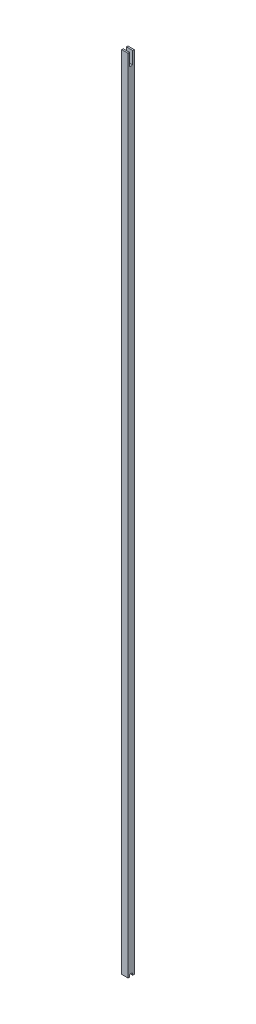
ISO-10303-21;
HEADER;
FILE_DESCRIPTION(('STEP AP214'),'2;1');
FILE_NAME('part.step','',(''),(''),'','','');
FILE_SCHEMA(('AUTOMOTIVE_DESIGN { 1 0 10303 214 1 1 1 1 }'));
ENDSEC;
DATA;
#1=APPLICATION_CONTEXT('core data for automotive mechanical design processes');
#2=APPLICATION_PROTOCOL_DEFINITION('international standard','automotive_design',2000,#1);
#3=PRODUCT_CONTEXT('',#1,'mechanical');
#4=PRODUCT('Part','Part','',(#3));
#5=PRODUCT_RELATED_PRODUCT_CATEGORY('part','',(#4));
#6=PRODUCT_DEFINITION_FORMATION('','',#4);
#7=PRODUCT_DEFINITION_CONTEXT('part definition',#1,'design');
#8=PRODUCT_DEFINITION('design','',#6,#7);
#9=PRODUCT_DEFINITION_SHAPE('','',#8);
#10=(LENGTH_UNIT() NAMED_UNIT(*) SI_UNIT(.MILLI.,.METRE.));
#11=(NAMED_UNIT(*) PLANE_ANGLE_UNIT() SI_UNIT($,.RADIAN.));
#12=(NAMED_UNIT(*) SI_UNIT($,.STERADIAN.) SOLID_ANGLE_UNIT());
#13=UNCERTAINTY_MEASURE_WITH_UNIT(LENGTH_MEASURE(1.E-05),#10,'distance_accuracy_value','');
#14=(GEOMETRIC_REPRESENTATION_CONTEXT(3) GLOBAL_UNCERTAINTY_ASSIGNED_CONTEXT((#13)) GLOBAL_UNIT_ASSIGNED_CONTEXT((#10,
#11,#12)) REPRESENTATION_CONTEXT('',''));
#15=CARTESIAN_POINT('',(0.,0.,0.));
#16=DIRECTION('',(0.,0.,1.));
#17=DIRECTION('',(1.,0.,0.));
#18=AXIS2_PLACEMENT_3D('',#15,#16,#17);
#19=CARTESIAN_POINT('',(6.35,812.8,0.));
#20=DIRECTION('',(0.,0.,-1.));
#21=DIRECTION('',(-1.,0.,0.));
#22=AXIS2_PLACEMENT_3D('',#19,#20,#21);
#23=PLANE('',#22);
#24=DIRECTION('',(0.,-1.,0.));
#25=VECTOR('',#24,1.);
#26=CARTESIAN_POINT('',(0.,812.8,0.));
#27=LINE('',#26,#25);
#28=CARTESIAN_POINT('',(0.,812.8,0.));
#29=VERTEX_POINT('',#28);
#30=CARTESIAN_POINT('',(0.,0.,0.));
#31=VERTEX_POINT('',#30);
#32=EDGE_CURVE('E159',#29,#31,#27,.T.);
#33=ORIENTED_EDGE('',*,*,#32,.T.);
#34=DIRECTION('',(-1.,0.,0.));
#35=VECTOR('',#34,1.);
#36=CARTESIAN_POINT('',(6.35,0.,0.));
#37=LINE('',#36,#35);
#38=CARTESIAN_POINT('',(6.35,0.,0.));
#39=VERTEX_POINT('',#38);
#40=EDGE_CURVE('E11',#39,#31,#37,.T.);
#41=ORIENTED_EDGE('',*,*,#40,.F.);
#42=DIRECTION('',(0.,-1.,0.));
#43=VECTOR('',#42,1.);
#44=CARTESIAN_POINT('',(6.35,812.8,0.));
#45=LINE('',#44,#43);
#46=CARTESIAN_POINT('',(6.35,812.8,0.));
#47=VERTEX_POINT('',#46);
#48=EDGE_CURVE('E181',#47,#39,#45,.T.);
#49=ORIENTED_EDGE('',*,*,#48,.F.);
#50=DIRECTION('',(-1.,0.,0.));
#51=VECTOR('',#50,1.);
#52=CARTESIAN_POINT('',(6.35,812.8,0.));
#53=LINE('',#52,#51);
#54=EDGE_CURVE('E155',#47,#29,#53,.T.);
#55=ORIENTED_EDGE('',*,*,#54,.T.);
#56=EDGE_LOOP('',(#33,#41,#49,#55));
#57=FACE_BOUND('',#56,.T.);
#58=ADVANCED_FACE('F39',(#57),#23,.F.);
#59=CARTESIAN_POINT('',(6.35,0.,0.));
#60=DIRECTION('',(0.,1.,0.));
#61=DIRECTION('',(0.,0.,1.));
#62=AXIS2_PLACEMENT_3D('',#59,#60,#61);
#63=PLANE('',#62);
#64=DIRECTION('',(0.,0.,-1.));
#65=VECTOR('',#64,1.);
#66=CARTESIAN_POINT('',(0.,0.,0.));
#67=LINE('',#66,#65);
#68=CARTESIAN_POINT('',(0.,0.,-1.5875));
#69=VERTEX_POINT('',#68);
#70=EDGE_CURVE('E162',#31,#69,#67,.T.);
#71=ORIENTED_EDGE('',*,*,#70,.T.);
#72=DIRECTION('',(-1.,0.,0.));
#73=VECTOR('',#72,1.);
#74=CARTESIAN_POINT('',(6.35,0.,-1.5875));
#75=LINE('',#74,#73);
#76=CARTESIAN_POINT('',(6.35,0.,-1.5875));
#77=VERTEX_POINT('',#76);
#78=EDGE_CURVE('E50',#77,#69,#75,.T.);
#79=ORIENTED_EDGE('',*,*,#78,.F.);
#80=DIRECTION('',(0.,0.,-1.));
#81=VECTOR('',#80,1.);
#82=CARTESIAN_POINT('',(6.35,0.,0.));
#83=LINE('',#82,#81);
#84=EDGE_CURVE('E110',#39,#77,#83,.T.);
#85=ORIENTED_EDGE('',*,*,#84,.F.);
#86=ORIENTED_EDGE('',*,*,#40,.T.);
#87=EDGE_LOOP('',(#71,#79,#85,#86));
#88=FACE_BOUND('',#87,.T.);
#89=ADVANCED_FACE('F260',(#88),#63,.F.);
#90=CARTESIAN_POINT('',(6.35,0.,-1.5875));
#91=DIRECTION('',(0.,0.,1.));
#92=DIRECTION('',(1.,0.,0.));
#93=AXIS2_PLACEMENT_3D('',#90,#91,#92);
#94=PLANE('',#93);
#95=DIRECTION('',(0.,1.,0.));
#96=VECTOR('',#95,1.);
#97=CARTESIAN_POINT('',(0.,0.,-1.5875));
#98=LINE('',#97,#96);
#99=CARTESIAN_POINT('',(0.,2.38125,-1.5875));
#100=VERTEX_POINT('',#99);
#101=EDGE_CURVE('E163',#69,#100,#98,.T.);
#102=ORIENTED_EDGE('',*,*,#101,.T.);
#103=DIRECTION('',(-1.,0.,0.));
#104=VECTOR('',#103,1.);
#105=CARTESIAN_POINT('',(6.35,2.38125,-1.5875));
#106=LINE('',#105,#104);
#107=CARTESIAN_POINT('',(6.35,2.38125,-1.5875));
#108=VERTEX_POINT('',#107);
#109=EDGE_CURVE('E200',#108,#100,#106,.T.);
#110=ORIENTED_EDGE('',*,*,#109,.F.);
#111=DIRECTION('',(0.,1.,0.));
#112=VECTOR('',#111,1.);
#113=CARTESIAN_POINT('',(6.35,0.,-1.5875));
#114=LINE('',#113,#112);
#115=EDGE_CURVE('E209',#77,#108,#114,.T.);
#116=ORIENTED_EDGE('',*,*,#115,.F.);
#117=ORIENTED_EDGE('',*,*,#78,.T.);
#118=EDGE_LOOP('',(#102,#110,#116,#117));
#119=FACE_BOUND('',#118,.T.);
#120=ADVANCED_FACE('F206',(#119),#94,.F.);
#121=CARTESIAN_POINT('',(6.35,2.38125,-1.5875));
#122=DIRECTION('',(0.,1.,0.));
#123=DIRECTION('',(0.,0.,1.));
#124=AXIS2_PLACEMENT_3D('',#121,#122,#123);
#125=PLANE('',#124);
#126=DIRECTION('',(0.,0.,-1.));
#127=VECTOR('',#126,1.);
#128=CARTESIAN_POINT('',(0.,2.38125,-1.5875));
#129=LINE('',#128,#127);
#130=CARTESIAN_POINT('',(0.,2.38125,-4.7625));
#131=VERTEX_POINT('',#130);
#132=EDGE_CURVE('E168',#100,#131,#129,.T.);
#133=ORIENTED_EDGE('',*,*,#132,.T.);
#134=DIRECTION('',(-1.,0.,0.));
#135=VECTOR('',#134,1.);
#136=CARTESIAN_POINT('',(6.35,2.38125,-4.7625));
#137=LINE('',#136,#135);
#138=CARTESIAN_POINT('',(6.35,2.38125,-4.7625));
#139=VERTEX_POINT('',#138);
#140=EDGE_CURVE('E197',#139,#131,#137,.T.);
#141=ORIENTED_EDGE('',*,*,#140,.F.);
#142=DIRECTION('',(0.,0.,-1.));
#143=VECTOR('',#142,1.);
#144=CARTESIAN_POINT('',(6.35,2.38125,-1.5875));
#145=LINE('',#144,#143);
#146=EDGE_CURVE('E226',#108,#139,#145,.T.);
#147=ORIENTED_EDGE('',*,*,#146,.F.);
#148=ORIENTED_EDGE('',*,*,#109,.T.);
#149=EDGE_LOOP('',(#133,#141,#147,#148));
#150=FACE_BOUND('',#149,.T.);
#151=ADVANCED_FACE('F220',(#150),#125,.F.);
#152=CARTESIAN_POINT('',(6.35,2.38125,-4.7625));
#153=DIRECTION('',(0.,0.,-1.));
#154=DIRECTION('',(-1.,0.,0.));
#155=AXIS2_PLACEMENT_3D('',#152,#153,#154);
#156=PLANE('',#155);
#157=DIRECTION('',(0.,-1.,0.));
#158=VECTOR('',#157,1.);
#159=CARTESIAN_POINT('',(0.,2.38125,-4.7625));
#160=LINE('',#159,#158);
#161=CARTESIAN_POINT('',(0.,0.,-4.7625));
#162=VERTEX_POINT('',#161);
#163=EDGE_CURVE('E166',#131,#162,#160,.T.);
#164=ORIENTED_EDGE('',*,*,#163,.T.);
#165=DIRECTION('',(-1.,0.,0.));
#166=VECTOR('',#165,1.);
#167=CARTESIAN_POINT('',(6.35,0.,-4.7625));
#168=LINE('',#167,#166);
#169=CARTESIAN_POINT('',(6.35,0.,-4.7625));
#170=VERTEX_POINT('',#169);
#171=EDGE_CURVE('E191',#170,#162,#168,.T.);
#172=ORIENTED_EDGE('',*,*,#171,.F.);
#173=DIRECTION('',(0.,-1.,0.));
#174=VECTOR('',#173,1.);
#175=CARTESIAN_POINT('',(6.35,2.38125,-4.7625));
#176=LINE('',#175,#174);
#177=EDGE_CURVE('E223',#139,#170,#176,.T.);
#178=ORIENTED_EDGE('',*,*,#177,.F.);
#179=ORIENTED_EDGE('',*,*,#140,.T.);
#180=EDGE_LOOP('',(#164,#172,#178,#179));
#181=FACE_BOUND('',#180,.T.);
#182=ADVANCED_FACE('F221',(#181),#156,.F.);
#183=CARTESIAN_POINT('',(6.35,0.,-4.7625));
#184=DIRECTION('',(0.,1.,0.));
#185=DIRECTION('',(0.,0.,1.));
#186=AXIS2_PLACEMENT_3D('',#183,#184,#185);
#187=PLANE('',#186);
#188=DIRECTION('',(0.,0.,-1.));
#189=VECTOR('',#188,1.);
#190=CARTESIAN_POINT('',(0.,0.,-4.7625));
#191=LINE('',#190,#189);
#192=CARTESIAN_POINT('',(0.,0.,-6.35));
#193=VERTEX_POINT('',#192);
#194=EDGE_CURVE('E169',#162,#193,#191,.T.);
#195=ORIENTED_EDGE('',*,*,#194,.T.);
#196=DIRECTION('',(-1.,0.,0.));
#197=VECTOR('',#196,1.);
#198=CARTESIAN_POINT('',(6.35,0.,-6.35));
#199=LINE('',#198,#197);
#200=CARTESIAN_POINT('',(6.35,0.,-6.35));
#201=VERTEX_POINT('',#200);
#202=EDGE_CURVE('E192',#201,#193,#199,.T.);
#203=ORIENTED_EDGE('',*,*,#202,.F.);
#204=DIRECTION('',(0.,0.,-1.));
#205=VECTOR('',#204,1.);
#206=CARTESIAN_POINT('',(6.35,0.,-4.7625));
#207=LINE('',#206,#205);
#208=EDGE_CURVE('E224',#170,#201,#207,.T.);
#209=ORIENTED_EDGE('',*,*,#208,.F.);
#210=ORIENTED_EDGE('',*,*,#171,.T.);
#211=EDGE_LOOP('',(#195,#203,#209,#210));
#212=FACE_BOUND('',#211,.T.);
#213=ADVANCED_FACE('F275',(#212),#187,.F.);
#214=CARTESIAN_POINT('',(6.35,0.,-6.35));
#215=DIRECTION('',(0.,0.,1.));
#216=DIRECTION('',(1.,0.,0.));
#217=AXIS2_PLACEMENT_3D('',#214,#215,#216);
#218=PLANE('',#217);
#219=DIRECTION('',(0.,1.,0.));
#220=VECTOR('',#219,1.);
#221=CARTESIAN_POINT('',(0.,0.,-6.35));
#222=LINE('',#221,#220);
#223=CARTESIAN_POINT('',(0.,812.8,-6.35));
#224=VERTEX_POINT('',#223);
#225=EDGE_CURVE('E175',#193,#224,#222,.T.);
#226=ORIENTED_EDGE('',*,*,#225,.T.);
#227=DIRECTION('',(-1.,0.,0.));
#228=VECTOR('',#227,1.);
#229=CARTESIAN_POINT('',(6.35,812.8,-6.35));
#230=LINE('',#229,#228);
#231=CARTESIAN_POINT('',(6.35,812.8,-6.35));
#232=VERTEX_POINT('',#231);
#233=EDGE_CURVE('E187',#232,#224,#230,.T.);
#234=ORIENTED_EDGE('',*,*,#233,.F.);
#235=DIRECTION('',(0.,1.,0.));
#236=VECTOR('',#235,1.);
#237=CARTESIAN_POINT('',(6.35,0.,-6.35));
#238=LINE('',#237,#236);
#239=EDGE_CURVE('E228',#201,#232,#238,.T.);
#240=ORIENTED_EDGE('',*,*,#239,.F.);
#241=ORIENTED_EDGE('',*,*,#202,.T.);
#242=EDGE_LOOP('',(#226,#234,#240,#241));
#243=FACE_BOUND('',#242,.T.);
#244=ADVANCED_FACE('F274',(#243),#218,.F.);
#245=CARTESIAN_POINT('',(6.35,812.8,-6.35));
#246=DIRECTION('',(0.,-1.,0.));
#247=DIRECTION('',(0.,0.,-1.));
#248=AXIS2_PLACEMENT_3D('',#245,#246,#247);
#249=PLANE('',#248);
#250=DIRECTION('',(0.,0.,1.));
#251=VECTOR('',#250,1.);
#252=CARTESIAN_POINT('',(0.,812.8,-6.35));
#253=LINE('',#252,#251);
#254=CARTESIAN_POINT('',(0.,812.8,-4.7625));
#255=VERTEX_POINT('',#254);
#256=EDGE_CURVE('E174',#224,#255,#253,.T.);
#257=ORIENTED_EDGE('',*,*,#256,.T.);
#258=DIRECTION('',(-1.,0.,0.));
#259=VECTOR('',#258,1.);
#260=CARTESIAN_POINT('',(6.35,812.8,-4.7625));
#261=LINE('',#260,#259);
#262=CARTESIAN_POINT('',(6.35,812.8,-4.7625));
#263=VERTEX_POINT('',#262);
#264=EDGE_CURVE('E184',#263,#255,#261,.T.);
#265=ORIENTED_EDGE('',*,*,#264,.F.);
#266=DIRECTION('',(0.,0.,1.));
#267=VECTOR('',#266,1.);
#268=CARTESIAN_POINT('',(6.35,812.8,-6.35));
#269=LINE('',#268,#267);
#270=EDGE_CURVE('E233',#232,#263,#269,.T.);
#271=ORIENTED_EDGE('',*,*,#270,.F.);
#272=ORIENTED_EDGE('',*,*,#233,.T.);
#273=EDGE_LOOP('',(#257,#265,#271,#272));
#274=FACE_BOUND('',#273,.T.);
#275=ADVANCED_FACE('F238',(#274),#249,.F.);
#276=CARTESIAN_POINT('',(6.35,812.8,-4.7625));
#277=DIRECTION('',(0.,0.,-1.));
#278=DIRECTION('',(-1.,0.,0.));
#279=AXIS2_PLACEMENT_3D('',#276,#277,#278);
#280=PLANE('',#279);
#281=DIRECTION('',(0.,-1.,0.));
#282=VECTOR('',#281,1.);
#283=CARTESIAN_POINT('',(0.,812.8,-4.7625));
#284=LINE('',#283,#282);
#285=CARTESIAN_POINT('',(0.,800.1,-4.7625));
#286=VERTEX_POINT('',#285);
#287=EDGE_CURVE('E176',#255,#286,#284,.T.);
#288=ORIENTED_EDGE('',*,*,#287,.T.);
#289=DIRECTION('',(-1.,0.,0.));
#290=VECTOR('',#289,1.);
#291=CARTESIAN_POINT('',(6.35,800.1,-4.7625));
#292=LINE('',#291,#290);
#293=CARTESIAN_POINT('',(6.35,800.1,-4.7625));
#294=VERTEX_POINT('',#293);
#295=EDGE_CURVE('E148',#294,#286,#292,.T.);
#296=ORIENTED_EDGE('',*,*,#295,.F.);
#297=DIRECTION('',(0.,-1.,0.));
#298=VECTOR('',#297,1.);
#299=CARTESIAN_POINT('',(6.35,812.8,-4.7625));
#300=LINE('',#299,#298);
#301=EDGE_CURVE('E141',#263,#294,#300,.T.);
#302=ORIENTED_EDGE('',*,*,#301,.F.);
#303=ORIENTED_EDGE('',*,*,#264,.T.);
#304=EDGE_LOOP('',(#288,#296,#302,#303));
#305=FACE_BOUND('',#304,.T.);
#306=ADVANCED_FACE('F243',(#305),#280,.F.);
#307=CARTESIAN_POINT('',(6.35,800.1,-4.7625));
#308=DIRECTION('',(0.,-1.,0.));
#309=DIRECTION('',(0.,0.,-1.));
#310=AXIS2_PLACEMENT_3D('',#307,#308,#309);
#311=PLANE('',#310);
#312=DIRECTION('',(0.,0.,1.));
#313=VECTOR('',#312,1.);
#314=CARTESIAN_POINT('',(0.,800.1,-4.7625));
#315=LINE('',#314,#313);
#316=CARTESIAN_POINT('',(0.,800.1,-1.5875));
#317=VERTEX_POINT('',#316);
#318=EDGE_CURVE('E146',#286,#317,#315,.T.);
#319=ORIENTED_EDGE('',*,*,#318,.T.);
#320=DIRECTION('',(-1.,0.,0.));
#321=VECTOR('',#320,1.);
#322=CARTESIAN_POINT('',(6.35,800.1,-1.5875));
#323=LINE('',#322,#321);
#324=CARTESIAN_POINT('',(6.35,800.1,-1.5875));
#325=VERTEX_POINT('',#324);
#326=EDGE_CURVE('E147',#325,#317,#323,.T.);
#327=ORIENTED_EDGE('',*,*,#326,.F.);
#328=DIRECTION('',(0.,0.,1.));
#329=VECTOR('',#328,1.);
#330=CARTESIAN_POINT('',(6.35,800.1,-4.7625));
#331=LINE('',#330,#329);
#332=EDGE_CURVE('E134',#294,#325,#331,.T.);
#333=ORIENTED_EDGE('',*,*,#332,.F.);
#334=ORIENTED_EDGE('',*,*,#295,.T.);
#335=EDGE_LOOP('',(#319,#327,#333,#334));
#336=FACE_BOUND('',#335,.T.);
#337=ADVANCED_FACE('F150',(#336),#311,.F.);
#338=CARTESIAN_POINT('',(6.35,800.1,-1.5875));
#339=DIRECTION('',(0.,0.,1.));
#340=DIRECTION('',(1.,0.,0.));
#341=AXIS2_PLACEMENT_3D('',#338,#339,#340);
#342=PLANE('',#341);
#343=DIRECTION('',(0.,1.,0.));
#344=VECTOR('',#343,1.);
#345=CARTESIAN_POINT('',(0.,800.1,-1.5875));
#346=LINE('',#345,#344);
#347=CARTESIAN_POINT('',(0.,812.8,-1.5875));
#348=VERTEX_POINT('',#347);
#349=EDGE_CURVE('E96',#317,#348,#346,.T.);
#350=ORIENTED_EDGE('',*,*,#349,.T.);
#351=DIRECTION('',(-1.,0.,0.));
#352=VECTOR('',#351,1.);
#353=CARTESIAN_POINT('',(6.35,812.8,-1.5875));
#354=LINE('',#353,#352);
#355=CARTESIAN_POINT('',(6.35,812.8,-1.5875));
#356=VERTEX_POINT('',#355);
#357=EDGE_CURVE('E151',#356,#348,#354,.T.);
#358=ORIENTED_EDGE('',*,*,#357,.F.);
#359=DIRECTION('',(0.,1.,0.));
#360=VECTOR('',#359,1.);
#361=CARTESIAN_POINT('',(6.35,800.1,-1.5875));
#362=LINE('',#361,#360);
#363=EDGE_CURVE('E137',#325,#356,#362,.T.);
#364=ORIENTED_EDGE('',*,*,#363,.F.);
#365=ORIENTED_EDGE('',*,*,#326,.T.);
#366=EDGE_LOOP('',(#350,#358,#364,#365));
#367=FACE_BOUND('',#366,.T.);
#368=ADVANCED_FACE('F154',(#367),#342,.F.);
#369=CARTESIAN_POINT('',(6.35,812.8,-1.5875));
#370=DIRECTION('',(0.,-1.,0.));
#371=DIRECTION('',(0.,0.,-1.));
#372=AXIS2_PLACEMENT_3D('',#369,#370,#371);
#373=PLANE('',#372);
#374=DIRECTION('',(0.,0.,1.));
#375=VECTOR('',#374,1.);
#376=CARTESIAN_POINT('',(0.,812.8,-1.5875));
#377=LINE('',#376,#375);
#378=EDGE_CURVE('E105',#348,#29,#377,.T.);
#379=ORIENTED_EDGE('',*,*,#378,.T.);
#380=ORIENTED_EDGE('',*,*,#54,.F.);
#381=DIRECTION('',(0.,0.,1.));
#382=VECTOR('',#381,1.);
#383=CARTESIAN_POINT('',(6.35,812.8,-1.5875));
#384=LINE('',#383,#382);
#385=EDGE_CURVE('E54',#356,#47,#384,.T.);
#386=ORIENTED_EDGE('',*,*,#385,.F.);
#387=ORIENTED_EDGE('',*,*,#357,.T.);
#388=EDGE_LOOP('',(#379,#380,#386,#387));
#389=FACE_BOUND('',#388,.T.);
#390=ADVANCED_FACE('F246',(#389),#373,.F.);
#391=CARTESIAN_POINT('',(6.35,0.,0.));
#392=DIRECTION('',(1.,0.,0.));
#393=DIRECTION('',(0.,0.,-1.));
#394=AXIS2_PLACEMENT_3D('',#391,#392,#393);
#395=PLANE('',#394);
#396=ORIENTED_EDGE('',*,*,#48,.T.);
#397=ORIENTED_EDGE('',*,*,#84,.T.);
#398=ORIENTED_EDGE('',*,*,#115,.T.);
#399=ORIENTED_EDGE('',*,*,#146,.T.);
#400=ORIENTED_EDGE('',*,*,#177,.T.);
#401=ORIENTED_EDGE('',*,*,#208,.T.);
#402=ORIENTED_EDGE('',*,*,#239,.T.);
#403=ORIENTED_EDGE('',*,*,#270,.T.);
#404=ORIENTED_EDGE('',*,*,#301,.T.);
#405=ORIENTED_EDGE('',*,*,#332,.T.);
#406=ORIENTED_EDGE('',*,*,#363,.T.);
#407=ORIENTED_EDGE('',*,*,#385,.T.);
#408=EDGE_LOOP('',(#396,#397,#398,#399,#400,#401,#402,#403,#404,#405,#406,#407));
#409=FACE_BOUND('',#408,.T.);
#410=ADVANCED_FACE('F140',(#409),#395,.T.);
#411=CARTESIAN_POINT('',(0.,0.,0.));
#412=DIRECTION('',(1.,0.,0.));
#413=DIRECTION('',(0.,0.,-1.));
#414=AXIS2_PLACEMENT_3D('',#411,#412,#413);
#415=PLANE('',#414);
#416=ORIENTED_EDGE('',*,*,#32,.F.);
#417=ORIENTED_EDGE('',*,*,#378,.F.);
#418=ORIENTED_EDGE('',*,*,#349,.F.);
#419=ORIENTED_EDGE('',*,*,#318,.F.);
#420=ORIENTED_EDGE('',*,*,#287,.F.);
#421=ORIENTED_EDGE('',*,*,#256,.F.);
#422=ORIENTED_EDGE('',*,*,#225,.F.);
#423=ORIENTED_EDGE('',*,*,#194,.F.);
#424=ORIENTED_EDGE('',*,*,#163,.F.);
#425=ORIENTED_EDGE('',*,*,#132,.F.);
#426=ORIENTED_EDGE('',*,*,#101,.F.);
#427=ORIENTED_EDGE('',*,*,#70,.F.);
#428=EDGE_LOOP('',(#416,#417,#418,#419,#420,#421,#422,#423,#424,#425,#426,#427));
#429=FACE_BOUND('',#428,.T.);
#430=ADVANCED_FACE('F212',(#429),#415,.F.);
#431=CLOSED_SHELL('',(#58,#89,#120,#151,#182,#213,#244,#275,#306,#337,#368,#390,#410,#430));
#432=MANIFOLD_SOLID_BREP('B2',#431);
#433=ADVANCED_BREP_SHAPE_REPRESENTATION('',(#18,#432),#14);
#434=SHAPE_DEFINITION_REPRESENTATION(#9,#433);
ENDSEC;
END-ISO-10303-21;
